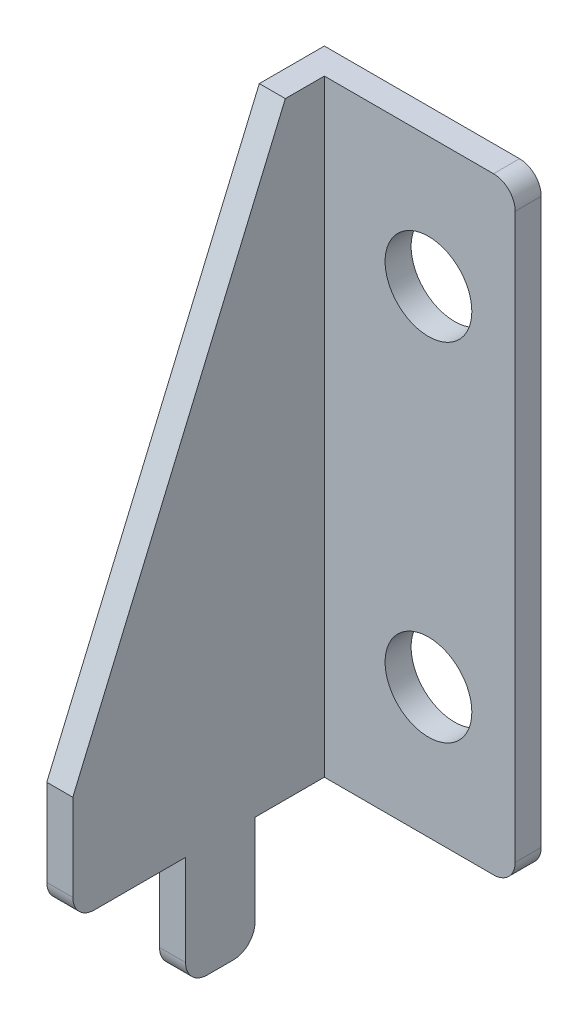
ISO-10303-21;
HEADER;
FILE_DESCRIPTION(('STEP AP214'),'2;1');
FILE_NAME('part.step','',(''),(''),'','','');
FILE_SCHEMA(('AUTOMOTIVE_DESIGN { 1 0 10303 214 1 1 1 1 }'));
ENDSEC;
DATA;
#1=APPLICATION_CONTEXT('core data for automotive mechanical design processes');
#2=APPLICATION_PROTOCOL_DEFINITION('international standard','automotive_design',2000,#1);
#3=PRODUCT_CONTEXT('',#1,'mechanical');
#4=PRODUCT('Part','Part','',(#3));
#5=PRODUCT_RELATED_PRODUCT_CATEGORY('part','',(#4));
#6=PRODUCT_DEFINITION_FORMATION('','',#4);
#7=PRODUCT_DEFINITION_CONTEXT('part definition',#1,'design');
#8=PRODUCT_DEFINITION('design','',#6,#7);
#9=PRODUCT_DEFINITION_SHAPE('','',#8);
#10=(LENGTH_UNIT() NAMED_UNIT(*) SI_UNIT(.MILLI.,.METRE.));
#11=(NAMED_UNIT(*) PLANE_ANGLE_UNIT() SI_UNIT($,.RADIAN.));
#12=(NAMED_UNIT(*) SI_UNIT($,.STERADIAN.) SOLID_ANGLE_UNIT());
#13=UNCERTAINTY_MEASURE_WITH_UNIT(LENGTH_MEASURE(1.E-05),#10,'distance_accuracy_value','');
#14=(GEOMETRIC_REPRESENTATION_CONTEXT(3) GLOBAL_UNCERTAINTY_ASSIGNED_CONTEXT((#13)) GLOBAL_UNIT_ASSIGNED_CONTEXT((#10,
#11,#12)) REPRESENTATION_CONTEXT('',''));
#15=CARTESIAN_POINT('',(0.,0.,0.));
#16=DIRECTION('',(0.,0.,1.));
#17=DIRECTION('',(1.,0.,0.));
#18=AXIS2_PLACEMENT_3D('',#15,#16,#17);
#19=CARTESIAN_POINT('',(6.2,13.5,0.6426522117404));
#20=DIRECTION('',(0.,0.,-1.));
#21=DIRECTION('',(-1.,0.,0.));
#22=AXIS2_PLACEMENT_3D('',#19,#20,#21);
#23=CYLINDRICAL_SURFACE('',#22,0.5);
#24=CARTESIAN_POINT('',(6.2,13.5,0.6));
#25=DIRECTION('',(0.,0.,-1.));
#26=DIRECTION('',(-1.,0.,0.));
#27=AXIS2_PLACEMENT_3D('',#24,#25,#26);
#28=CIRCLE('',#27,0.5);
#29=CARTESIAN_POINT('',(6.7,13.5,0.6));
#30=VERTEX_POINT('',#29);
#31=CARTESIAN_POINT('',(6.2,14.,0.6));
#32=VERTEX_POINT('',#31);
#33=EDGE_CURVE('E20',#30,#32,#28,.F.);
#34=ORIENTED_EDGE('',*,*,#33,.F.);
#35=DIRECTION('',(0.,0.,-1.));
#36=VECTOR('',#35,1.);
#37=CARTESIAN_POINT('',(6.7,13.5,0.));
#38=LINE('',#37,#36);
#39=CARTESIAN_POINT('',(6.7,13.5,0.));
#40=VERTEX_POINT('',#39);
#41=EDGE_CURVE('E104',#40,#30,#38,.F.);
#42=ORIENTED_EDGE('',*,*,#41,.F.);
#43=CARTESIAN_POINT('',(6.2,13.5,0.));
#44=DIRECTION('',(0.,0.,-1.));
#45=DIRECTION('',(-1.,0.,0.));
#46=AXIS2_PLACEMENT_3D('',#43,#44,#45);
#47=CIRCLE('',#46,0.5);
#48=CARTESIAN_POINT('',(6.2,14.,0.));
#49=VERTEX_POINT('',#48);
#50=EDGE_CURVE('E114',#40,#49,#47,.F.);
#51=ORIENTED_EDGE('',*,*,#50,.T.);
#52=DIRECTION('',(0.,0.,1.));
#53=VECTOR('',#52,1.);
#54=CARTESIAN_POINT('',(6.2,14.,0.));
#55=LINE('',#54,#53);
#56=EDGE_CURVE('E109',#32,#49,#55,.F.);
#57=ORIENTED_EDGE('',*,*,#56,.F.);
#58=EDGE_LOOP('',(#34,#42,#51,#57));
#59=FACE_BOUND('',#58,.T.);
#60=ADVANCED_FACE('F17',(#59),#23,.T.);
#61=CARTESIAN_POINT('',(6.7,14.,0.));
#62=DIRECTION('',(0.,1.,0.));
#63=DIRECTION('',(0.,0.,1.));
#64=AXIS2_PLACEMENT_3D('',#61,#62,#63);
#65=PLANE('',#64);
#66=DIRECTION('',(1.,0.,0.));
#67=VECTOR('',#66,1.);
#68=CARTESIAN_POINT('',(0.,14.,0.6));
#69=LINE('',#68,#67);
#70=CARTESIAN_POINT('',(2.3,14.,0.6));
#71=VERTEX_POINT('',#70);
#72=EDGE_CURVE('E122',#32,#71,#69,.F.);
#73=ORIENTED_EDGE('',*,*,#72,.F.);
#74=ORIENTED_EDGE('',*,*,#56,.T.);
#75=DIRECTION('',(1.,0.,0.));
#76=VECTOR('',#75,1.);
#77=CARTESIAN_POINT('',(0.,14.,0.));
#78=LINE('',#77,#76);
#79=CARTESIAN_POINT('',(1.7,14.,0.));
#80=VERTEX_POINT('',#79);
#81=EDGE_CURVE('E198',#49,#80,#78,.F.);
#82=ORIENTED_EDGE('',*,*,#81,.T.);
#83=DIRECTION('',(0.,0.,1.));
#84=VECTOR('',#83,1.);
#85=CARTESIAN_POINT('',(1.7,14.,0.));
#86=LINE('',#85,#84);
#87=CARTESIAN_POINT('',(1.7,14.,1.5));
#88=VERTEX_POINT('',#87);
#89=EDGE_CURVE('E118',#80,#88,#86,.T.);
#90=ORIENTED_EDGE('',*,*,#89,.T.);
#91=DIRECTION('',(1.,0.,0.));
#92=VECTOR('',#91,1.);
#93=CARTESIAN_POINT('',(1.7,14.,1.5));
#94=LINE('',#93,#92);
#95=CARTESIAN_POINT('',(2.3,14.,1.5));
#96=VERTEX_POINT('',#95);
#97=EDGE_CURVE('E156',#96,#88,#94,.F.);
#98=ORIENTED_EDGE('',*,*,#97,.F.);
#99=DIRECTION('',(0.,0.,-1.));
#100=VECTOR('',#99,1.);
#101=CARTESIAN_POINT('',(2.3,14.,0.));
#102=LINE('',#101,#100);
#103=EDGE_CURVE('E126',#71,#96,#102,.F.);
#104=ORIENTED_EDGE('',*,*,#103,.F.);
#105=EDGE_LOOP('',(#73,#74,#82,#90,#98,#104));
#106=FACE_BOUND('',#105,.T.);
#107=ADVANCED_FACE('F123',(#106),#65,.T.);
#108=CARTESIAN_POINT('',(6.7,0.,0.));
#109=DIRECTION('',(1.,0.,0.));
#110=DIRECTION('',(0.,0.,-1.));
#111=AXIS2_PLACEMENT_3D('',#108,#109,#110);
#112=PLANE('',#111);
#113=DIRECTION('',(0.,1.,0.));
#114=VECTOR('',#113,1.);
#115=CARTESIAN_POINT('',(6.7,0.,0.));
#116=LINE('',#115,#114);
#117=CARTESIAN_POINT('',(6.7,0.5,0.));
#118=VERTEX_POINT('',#117);
#119=EDGE_CURVE('E194',#118,#40,#116,.T.);
#120=ORIENTED_EDGE('',*,*,#119,.T.);
#121=ORIENTED_EDGE('',*,*,#41,.T.);
#122=DIRECTION('',(0.,1.,0.));
#123=VECTOR('',#122,1.);
#124=CARTESIAN_POINT('',(6.7,0.,0.6));
#125=LINE('',#124,#123);
#126=CARTESIAN_POINT('',(6.7,0.5,0.6));
#127=VERTEX_POINT('',#126);
#128=EDGE_CURVE('E130',#127,#30,#125,.T.);
#129=ORIENTED_EDGE('',*,*,#128,.F.);
#130=DIRECTION('',(0.,0.,-1.));
#131=VECTOR('',#130,1.);
#132=CARTESIAN_POINT('',(6.7,0.5,0.6289167537223));
#133=LINE('',#132,#131);
#134=EDGE_CURVE('E145',#118,#127,#133,.F.);
#135=ORIENTED_EDGE('',*,*,#134,.F.);
#136=EDGE_LOOP('',(#120,#121,#129,#135));
#137=FACE_BOUND('',#136,.T.);
#138=ADVANCED_FACE('F397',(#137),#112,.T.);
#139=CARTESIAN_POINT('',(4.7,3.,0.6));
#140=DIRECTION('',(0.,0.,1.));
#141=DIRECTION('',(1.,0.,0.));
#142=AXIS2_PLACEMENT_3D('',#139,#140,#141);
#143=CYLINDRICAL_SURFACE('',#142,1.);
#144=CARTESIAN_POINT('',(4.7,3.,0.6));
#145=DIRECTION('',(0.,0.,1.));
#146=DIRECTION('',(1.,0.,0.));
#147=AXIS2_PLACEMENT_3D('',#144,#145,#146);
#148=CIRCLE('',#147,1.);
#149=CARTESIAN_POINT('',(5.7,3.,0.6));
#150=VERTEX_POINT('',#149);
#151=EDGE_CURVE('E134',#150,#150,#148,.F.);
#152=ORIENTED_EDGE('',*,*,#151,.F.);
#153=EDGE_LOOP('',(#152));
#154=FACE_BOUND('',#153,.T.);
#155=CARTESIAN_POINT('',(4.7,3.,0.));
#156=DIRECTION('',(0.,0.,1.));
#157=DIRECTION('',(1.,0.,0.));
#158=AXIS2_PLACEMENT_3D('',#155,#156,#157);
#159=CIRCLE('',#158,1.);
#160=CARTESIAN_POINT('',(5.7,3.,0.));
#161=VERTEX_POINT('',#160);
#162=EDGE_CURVE('E191',#161,#161,#159,.F.);
#163=ORIENTED_EDGE('',*,*,#162,.T.);
#164=EDGE_LOOP('',(#163));
#165=FACE_BOUND('',#164,.T.);
#166=ADVANCED_FACE('F212',(#154,#165),#143,.F.);
#167=CARTESIAN_POINT('',(4.7,11.,0.6));
#168=DIRECTION('',(0.,0.,1.));
#169=DIRECTION('',(1.,0.,0.));
#170=AXIS2_PLACEMENT_3D('',#167,#168,#169);
#171=CYLINDRICAL_SURFACE('',#170,1.);
#172=CARTESIAN_POINT('',(4.7,11.,0.6));
#173=DIRECTION('',(0.,0.,1.));
#174=DIRECTION('',(1.,0.,0.));
#175=AXIS2_PLACEMENT_3D('',#172,#173,#174);
#176=CIRCLE('',#175,1.);
#177=CARTESIAN_POINT('',(5.7,11.,0.6));
#178=VERTEX_POINT('',#177);
#179=EDGE_CURVE('E136',#178,#178,#176,.F.);
#180=ORIENTED_EDGE('',*,*,#179,.F.);
#181=EDGE_LOOP('',(#180));
#182=FACE_BOUND('',#181,.T.);
#183=CARTESIAN_POINT('',(4.7,11.,0.));
#184=DIRECTION('',(0.,0.,1.));
#185=DIRECTION('',(1.,0.,0.));
#186=AXIS2_PLACEMENT_3D('',#183,#184,#185);
#187=CIRCLE('',#186,1.);
#188=CARTESIAN_POINT('',(5.7,11.,0.));
#189=VERTEX_POINT('',#188);
#190=EDGE_CURVE('E187',#189,#189,#187,.F.);
#191=ORIENTED_EDGE('',*,*,#190,.T.);
#192=EDGE_LOOP('',(#191));
#193=FACE_BOUND('',#192,.T.);
#194=ADVANCED_FACE('F209',(#182,#193),#171,.F.);
#195=CARTESIAN_POINT('',(0.,0.,0.6));
#196=DIRECTION('',(0.,0.,1.));
#197=DIRECTION('',(1.,0.,0.));
#198=AXIS2_PLACEMENT_3D('',#195,#196,#197);
#199=PLANE('',#198);
#200=ORIENTED_EDGE('',*,*,#179,.T.);
#201=EDGE_LOOP('',(#200));
#202=FACE_BOUND('',#201,.T.);
#203=ORIENTED_EDGE('',*,*,#151,.T.);
#204=EDGE_LOOP('',(#203));
#205=FACE_BOUND('',#204,.T.);
#206=ORIENTED_EDGE('',*,*,#128,.T.);
#207=ORIENTED_EDGE('',*,*,#33,.T.);
#208=ORIENTED_EDGE('',*,*,#72,.T.);
#209=DIRECTION('',(0.,1.,0.));
#210=VECTOR('',#209,1.);
#211=CARTESIAN_POINT('',(2.3,14.,0.6));
#212=LINE('',#211,#210);
#213=CARTESIAN_POINT('',(2.3,0.,0.6));
#214=VERTEX_POINT('',#213);
#215=EDGE_CURVE('E162',#214,#71,#212,.T.);
#216=ORIENTED_EDGE('',*,*,#215,.F.);
#217=DIRECTION('',(1.,0.,0.));
#218=VECTOR('',#217,1.);
#219=CARTESIAN_POINT('',(1.7,0.,0.6));
#220=LINE('',#219,#218);
#221=CARTESIAN_POINT('',(6.2,0.,0.6));
#222=VERTEX_POINT('',#221);
#223=EDGE_CURVE('E190',#222,#214,#220,.F.);
#224=ORIENTED_EDGE('',*,*,#223,.F.);
#225=CARTESIAN_POINT('',(6.2,0.5,0.6));
#226=DIRECTION('',(0.,0.,-1.));
#227=DIRECTION('',(-1.,0.,0.));
#228=AXIS2_PLACEMENT_3D('',#225,#226,#227);
#229=CIRCLE('',#228,0.5);
#230=EDGE_CURVE('E147',#127,#222,#229,.T.);
#231=ORIENTED_EDGE('',*,*,#230,.F.);
#232=EDGE_LOOP('',(#206,#207,#208,#216,#224,#231));
#233=FACE_BOUND('',#232,.T.);
#234=ADVANCED_FACE('F132',(#202,#205,#233),#199,.T.);
#235=CARTESIAN_POINT('',(6.2,0.5,0.6289167537223));
#236=DIRECTION('',(0.,0.,-1.));
#237=DIRECTION('',(-1.,0.,0.));
#238=AXIS2_PLACEMENT_3D('',#235,#236,#237);
#239=CYLINDRICAL_SURFACE('',#238,0.5);
#240=ORIENTED_EDGE('',*,*,#230,.T.);
#241=DIRECTION('',(0.,0.,-1.));
#242=VECTOR('',#241,1.);
#243=CARTESIAN_POINT('',(6.2,0.,0.));
#244=LINE('',#243,#242);
#245=CARTESIAN_POINT('',(6.2,0.,0.));
#246=VERTEX_POINT('',#245);
#247=EDGE_CURVE('E234',#246,#222,#244,.F.);
#248=ORIENTED_EDGE('',*,*,#247,.F.);
#249=CARTESIAN_POINT('',(6.2,0.5,0.));
#250=DIRECTION('',(0.,0.,-1.));
#251=DIRECTION('',(-1.,0.,0.));
#252=AXIS2_PLACEMENT_3D('',#249,#250,#251);
#253=CIRCLE('',#252,0.5);
#254=EDGE_CURVE('E195',#246,#118,#253,.F.);
#255=ORIENTED_EDGE('',*,*,#254,.T.);
#256=ORIENTED_EDGE('',*,*,#134,.T.);
#257=EDGE_LOOP('',(#240,#248,#255,#256));
#258=FACE_BOUND('',#257,.T.);
#259=ADVANCED_FACE('F235',(#258),#239,.T.);
#260=CARTESIAN_POINT('',(2.3,14.,0.));
#261=DIRECTION('',(1.,0.,0.));
#262=DIRECTION('',(0.,0.,-1.));
#263=AXIS2_PLACEMENT_3D('',#260,#261,#262);
#264=PLANE('',#263);
#265=DIRECTION('',(0.,1.,0.));
#266=VECTOR('',#265,1.);
#267=CARTESIAN_POINT('',(2.3,2.5,6.4));
#268=LINE('',#267,#266);
#269=CARTESIAN_POINT('',(2.3,0.5,6.4));
#270=VERTEX_POINT('',#269);
#271=CARTESIAN_POINT('',(2.3,2.50000000000012,6.40000000000028));
#272=VERTEX_POINT('',#271);
#273=EDGE_CURVE('E201',#270,#272,#268,.T.);
#274=ORIENTED_EDGE('',*,*,#273,.F.);
#275=CARTESIAN_POINT('',(2.3,0.5,5.9));
#276=DIRECTION('',(-1.,0.,0.));
#277=DIRECTION('',(0.,0.,1.));
#278=AXIS2_PLACEMENT_3D('',#275,#276,#277);
#279=CIRCLE('',#278,0.5);
#280=CARTESIAN_POINT('',(2.3,0.,5.9));
#281=VERTEX_POINT('',#280);
#282=EDGE_CURVE('E161',#270,#281,#279,.F.);
#283=ORIENTED_EDGE('',*,*,#282,.T.);
#284=DIRECTION('',(0.,0.,-1.));
#285=VECTOR('',#284,1.);
#286=CARTESIAN_POINT('',(2.3,0.,6.4));
#287=LINE('',#286,#285);
#288=CARTESIAN_POINT('',(2.3,0.,3.8));
#289=VERTEX_POINT('',#288);
#290=EDGE_CURVE('E276',#289,#281,#287,.F.);
#291=ORIENTED_EDGE('',*,*,#290,.F.);
#292=DIRECTION('',(0.,1.,0.));
#293=VECTOR('',#292,1.);
#294=CARTESIAN_POINT('',(2.3,0.,3.8));
#295=LINE('',#294,#293);
#296=CARTESIAN_POINT('',(2.3,-2.1,3.8));
#297=VERTEX_POINT('',#296);
#298=EDGE_CURVE('E181',#297,#289,#295,.T.);
#299=ORIENTED_EDGE('',*,*,#298,.F.);
#300=CARTESIAN_POINT('',(2.3,-2.1,3.3));
#301=DIRECTION('',(-1.,0.,0.));
#302=DIRECTION('',(0.,0.,1.));
#303=AXIS2_PLACEMENT_3D('',#300,#301,#302);
#304=CIRCLE('',#303,0.5);
#305=CARTESIAN_POINT('',(2.3,-2.6,3.3));
#306=VERTEX_POINT('',#305);
#307=EDGE_CURVE('E178',#306,#297,#304,.T.);
#308=ORIENTED_EDGE('',*,*,#307,.F.);
#309=DIRECTION('',(0.,0.,-1.));
#310=VECTOR('',#309,1.);
#311=CARTESIAN_POINT('',(2.3,-2.6,3.8));
#312=LINE('',#311,#310);
#313=CARTESIAN_POINT('',(2.3,-2.6,2.7));
#314=VERTEX_POINT('',#313);
#315=EDGE_CURVE('E286',#314,#306,#312,.F.);
#316=ORIENTED_EDGE('',*,*,#315,.F.);
#317=CARTESIAN_POINT('',(2.3,-2.1,2.7));
#318=DIRECTION('',(-1.,0.,0.));
#319=DIRECTION('',(0.,0.,1.));
#320=AXIS2_PLACEMENT_3D('',#317,#318,#319);
#321=CIRCLE('',#320,0.5);
#322=CARTESIAN_POINT('',(2.3,-2.1,2.2));
#323=VERTEX_POINT('',#322);
#324=EDGE_CURVE('E183',#323,#314,#321,.T.);
#325=ORIENTED_EDGE('',*,*,#324,.F.);
#326=DIRECTION('',(0.,1.,0.));
#327=VECTOR('',#326,1.);
#328=CARTESIAN_POINT('',(2.3,-2.6,2.2));
#329=LINE('',#328,#327);
#330=CARTESIAN_POINT('',(2.3,0.,2.2));
#331=VERTEX_POINT('',#330);
#332=EDGE_CURVE('E288',#331,#323,#329,.F.);
#333=ORIENTED_EDGE('',*,*,#332,.F.);
#334=DIRECTION('',(0.,0.,-1.));
#335=VECTOR('',#334,1.);
#336=CARTESIAN_POINT('',(2.3,0.,0.));
#337=LINE('',#336,#335);
#338=EDGE_CURVE('E244',#214,#331,#337,.F.);
#339=ORIENTED_EDGE('',*,*,#338,.F.);
#340=ORIENTED_EDGE('',*,*,#215,.T.);
#341=ORIENTED_EDGE('',*,*,#103,.T.);
#342=DIRECTION('',(0.,-0.919970561413031,0.391987456602113));
#343=VECTOR('',#342,1.);
#344=CARTESIAN_POINT('',(2.3,14.,1.5));
#345=LINE('',#344,#343);
#346=EDGE_CURVE('E153',#272,#96,#345,.F.);
#347=ORIENTED_EDGE('',*,*,#346,.F.);
#348=EDGE_LOOP('',(#274,#283,#291,#299,#308,#316,#325,#333,#339,#340,#341,#347));
#349=FACE_BOUND('',#348,.T.);
#350=ADVANCED_FACE('F301',(#349),#264,.T.);
#351=CARTESIAN_POINT('',(1.7,2.5,6.4));
#352=DIRECTION('',(0.,0.,1.));
#353=DIRECTION('',(1.,0.,0.));
#354=AXIS2_PLACEMENT_3D('',#351,#352,#353);
#355=PLANE('',#354);
#356=DIRECTION('',(0.,1.,0.));
#357=VECTOR('',#356,1.);
#358=CARTESIAN_POINT('',(1.7,14.,6.4));
#359=LINE('',#358,#357);
#360=CARTESIAN_POINT('',(1.7,0.5,6.4));
#361=VERTEX_POINT('',#360);
#362=CARTESIAN_POINT('',(1.7,2.50000000000005,6.40000000000014));
#363=VERTEX_POINT('',#362);
#364=EDGE_CURVE('E265',#361,#363,#359,.T.);
#365=ORIENTED_EDGE('',*,*,#364,.F.);
#366=DIRECTION('',(-1.,0.,0.));
#367=VECTOR('',#366,1.);
#368=CARTESIAN_POINT('',(2.328916753722,0.5,6.4));
#369=LINE('',#368,#367);
#370=EDGE_CURVE('E325',#270,#361,#369,.T.);
#371=ORIENTED_EDGE('',*,*,#370,.F.);
#372=ORIENTED_EDGE('',*,*,#273,.T.);
#373=DIRECTION('',(1.,0.,0.));
#374=VECTOR('',#373,1.);
#375=CARTESIAN_POINT('',(1.7,2.50000000000018,6.40000000000041));
#376=LINE('',#375,#374);
#377=EDGE_CURVE('E157',#363,#272,#376,.T.);
#378=ORIENTED_EDGE('',*,*,#377,.F.);
#379=EDGE_LOOP('',(#365,#371,#372,#378));
#380=FACE_BOUND('',#379,.T.);
#381=ADVANCED_FACE('F384',(#380),#355,.T.);
#382=CARTESIAN_POINT('',(1.7,14.,1.5));
#383=DIRECTION('',(0.,0.391987456602113,0.919970561413031));
#384=DIRECTION('',(0.,-0.919970561413031,0.391987456602113));
#385=AXIS2_PLACEMENT_3D('',#382,#383,#384);
#386=PLANE('',#385);
#387=ORIENTED_EDGE('',*,*,#97,.T.);
#388=DIRECTION('',(0.,0.919970561413045,-0.39198745660208));
#389=VECTOR('',#388,1.);
#390=CARTESIAN_POINT('',(1.7,2.5,6.4));
#391=LINE('',#390,#389);
#392=EDGE_CURVE('E256',#363,#88,#391,.T.);
#393=ORIENTED_EDGE('',*,*,#392,.F.);
#394=ORIENTED_EDGE('',*,*,#377,.T.);
#395=ORIENTED_EDGE('',*,*,#346,.T.);
#396=EDGE_LOOP('',(#387,#393,#394,#395));
#397=FACE_BOUND('',#396,.T.);
#398=ADVANCED_FACE('F220',(#397),#386,.T.);
#399=CARTESIAN_POINT('',(0.,0.,0.));
#400=DIRECTION('',(0.,0.,1.));
#401=DIRECTION('',(1.,0.,0.));
#402=AXIS2_PLACEMENT_3D('',#399,#400,#401);
#403=PLANE('',#402);
#404=ORIENTED_EDGE('',*,*,#190,.F.);
#405=EDGE_LOOP('',(#404));
#406=FACE_BOUND('',#405,.T.);
#407=ORIENTED_EDGE('',*,*,#162,.F.);
#408=EDGE_LOOP('',(#407));
#409=FACE_BOUND('',#408,.T.);
#410=ORIENTED_EDGE('',*,*,#254,.F.);
#411=DIRECTION('',(1.,0.,0.));
#412=VECTOR('',#411,1.);
#413=CARTESIAN_POINT('',(1.7,0.,0.));
#414=LINE('',#413,#412);
#415=CARTESIAN_POINT('',(1.7,0.,0.));
#416=VERTEX_POINT('',#415);
#417=EDGE_CURVE('E230',#416,#246,#414,.T.);
#418=ORIENTED_EDGE('',*,*,#417,.F.);
#419=DIRECTION('',(0.,1.,0.));
#420=VECTOR('',#419,1.);
#421=CARTESIAN_POINT('',(1.7,14.,0.));
#422=LINE('',#421,#420);
#423=EDGE_CURVE('E254',#80,#416,#422,.F.);
#424=ORIENTED_EDGE('',*,*,#423,.F.);
#425=ORIENTED_EDGE('',*,*,#81,.F.);
#426=ORIENTED_EDGE('',*,*,#50,.F.);
#427=ORIENTED_EDGE('',*,*,#119,.F.);
#428=EDGE_LOOP('',(#410,#418,#424,#425,#426,#427));
#429=FACE_BOUND('',#428,.T.);
#430=ADVANCED_FACE('F216',(#406,#409,#429),#403,.F.);
#431=CARTESIAN_POINT('',(1.7,0.,0.));
#432=DIRECTION('',(0.,-1.,0.));
#433=DIRECTION('',(0.,0.,-1.));
#434=AXIS2_PLACEMENT_3D('',#431,#432,#433);
#435=PLANE('',#434);
#436=ORIENTED_EDGE('',*,*,#417,.T.);
#437=ORIENTED_EDGE('',*,*,#247,.T.);
#438=ORIENTED_EDGE('',*,*,#223,.T.);
#439=ORIENTED_EDGE('',*,*,#338,.T.);
#440=DIRECTION('',(-1.,0.,0.));
#441=VECTOR('',#440,1.);
#442=CARTESIAN_POINT('',(1.7,0.,2.2));
#443=LINE('',#442,#441);
#444=CARTESIAN_POINT('',(1.7,0.,2.2));
#445=VERTEX_POINT('',#444);
#446=EDGE_CURVE('E238',#445,#331,#443,.F.);
#447=ORIENTED_EDGE('',*,*,#446,.F.);
#448=DIRECTION('',(0.,0.,1.));
#449=VECTOR('',#448,1.);
#450=CARTESIAN_POINT('',(1.7,0.,0.));
#451=LINE('',#450,#449);
#452=EDGE_CURVE('E242',#416,#445,#451,.T.);
#453=ORIENTED_EDGE('',*,*,#452,.F.);
#454=EDGE_LOOP('',(#436,#437,#438,#439,#447,#453));
#455=FACE_BOUND('',#454,.T.);
#456=ADVANCED_FACE('F219',(#455),#435,.T.);
#457=CARTESIAN_POINT('',(1.7,-2.6,2.2));
#458=DIRECTION('',(0.,0.,-1.));
#459=DIRECTION('',(-1.,0.,0.));
#460=AXIS2_PLACEMENT_3D('',#457,#458,#459);
#461=PLANE('',#460);
#462=ORIENTED_EDGE('',*,*,#332,.T.);
#463=DIRECTION('',(-1.,0.,0.));
#464=VECTOR('',#463,1.);
#465=CARTESIAN_POINT('',(2.328916753722,-2.1,2.2));
#466=LINE('',#465,#464);
#467=CARTESIAN_POINT('',(1.7,-2.1,2.2));
#468=VERTEX_POINT('',#467);
#469=EDGE_CURVE('E186',#468,#323,#466,.F.);
#470=ORIENTED_EDGE('',*,*,#469,.F.);
#471=DIRECTION('',(0.,1.,0.));
#472=VECTOR('',#471,1.);
#473=CARTESIAN_POINT('',(1.7,14.,2.2));
#474=LINE('',#473,#472);
#475=EDGE_CURVE('E177',#445,#468,#474,.F.);
#476=ORIENTED_EDGE('',*,*,#475,.F.);
#477=ORIENTED_EDGE('',*,*,#446,.T.);
#478=EDGE_LOOP('',(#462,#470,#476,#477));
#479=FACE_BOUND('',#478,.T.);
#480=ADVANCED_FACE('F309',(#479),#461,.T.);
#481=CARTESIAN_POINT('',(2.328916753722,-2.1,2.7));
#482=DIRECTION('',(-1.,0.,0.));
#483=DIRECTION('',(0.,0.,1.));
#484=AXIS2_PLACEMENT_3D('',#481,#482,#483);
#485=CYLINDRICAL_SURFACE('',#484,0.5);
#486=ORIENTED_EDGE('',*,*,#324,.T.);
#487=DIRECTION('',(1.,0.,0.));
#488=VECTOR('',#487,1.);
#489=CARTESIAN_POINT('',(1.7,-2.6,2.7));
#490=LINE('',#489,#488);
#491=CARTESIAN_POINT('',(1.7,-2.6,2.7));
#492=VERTEX_POINT('',#491);
#493=EDGE_CURVE('E185',#492,#314,#490,.T.);
#494=ORIENTED_EDGE('',*,*,#493,.F.);
#495=CARTESIAN_POINT('',(1.7,-2.1,2.7));
#496=DIRECTION('',(-1.,0.,0.));
#497=DIRECTION('',(0.,0.,1.));
#498=AXIS2_PLACEMENT_3D('',#495,#496,#497);
#499=CIRCLE('',#498,0.5);
#500=EDGE_CURVE('E174',#468,#492,#499,.T.);
#501=ORIENTED_EDGE('',*,*,#500,.F.);
#502=ORIENTED_EDGE('',*,*,#469,.T.);
#503=EDGE_LOOP('',(#486,#494,#501,#502));
#504=FACE_BOUND('',#503,.T.);
#505=ADVANCED_FACE('F346',(#504),#485,.T.);
#506=CARTESIAN_POINT('',(1.7,-2.6,3.8));
#507=DIRECTION('',(0.,-1.,0.));
#508=DIRECTION('',(0.,0.,-1.));
#509=AXIS2_PLACEMENT_3D('',#506,#507,#508);
#510=PLANE('',#509);
#511=ORIENTED_EDGE('',*,*,#315,.T.);
#512=DIRECTION('',(-1.,0.,0.));
#513=VECTOR('',#512,1.);
#514=CARTESIAN_POINT('',(2.328916753722,-2.6,3.3));
#515=LINE('',#514,#513);
#516=CARTESIAN_POINT('',(1.7,-2.6,3.3));
#517=VERTEX_POINT('',#516);
#518=EDGE_CURVE('E182',#517,#306,#515,.F.);
#519=ORIENTED_EDGE('',*,*,#518,.F.);
#520=DIRECTION('',(0.,0.,1.));
#521=VECTOR('',#520,1.);
#522=CARTESIAN_POINT('',(1.7,-2.6,0.));
#523=LINE('',#522,#521);
#524=EDGE_CURVE('E173',#492,#517,#523,.T.);
#525=ORIENTED_EDGE('',*,*,#524,.F.);
#526=ORIENTED_EDGE('',*,*,#493,.T.);
#527=EDGE_LOOP('',(#511,#519,#525,#526));
#528=FACE_BOUND('',#527,.T.);
#529=ADVANCED_FACE('F341',(#528),#510,.T.);
#530=CARTESIAN_POINT('',(2.328916753722,-2.1,3.3));
#531=DIRECTION('',(-1.,0.,0.));
#532=DIRECTION('',(0.,0.,1.));
#533=AXIS2_PLACEMENT_3D('',#530,#531,#532);
#534=CYLINDRICAL_SURFACE('',#533,0.5);
#535=ORIENTED_EDGE('',*,*,#307,.T.);
#536=DIRECTION('',(1.,0.,0.));
#537=VECTOR('',#536,1.);
#538=CARTESIAN_POINT('',(1.7,-2.1,3.8));
#539=LINE('',#538,#537);
#540=CARTESIAN_POINT('',(1.7,-2.1,3.8));
#541=VERTEX_POINT('',#540);
#542=EDGE_CURVE('E283',#541,#297,#539,.T.);
#543=ORIENTED_EDGE('',*,*,#542,.F.);
#544=CARTESIAN_POINT('',(1.7,-2.1,3.3));
#545=DIRECTION('',(-1.,0.,0.));
#546=DIRECTION('',(0.,0.,1.));
#547=AXIS2_PLACEMENT_3D('',#544,#545,#546);
#548=CIRCLE('',#547,0.5);
#549=EDGE_CURVE('E169',#517,#541,#548,.T.);
#550=ORIENTED_EDGE('',*,*,#549,.F.);
#551=ORIENTED_EDGE('',*,*,#518,.T.);
#552=EDGE_LOOP('',(#535,#543,#550,#551));
#553=FACE_BOUND('',#552,.T.);
#554=ADVANCED_FACE('F350',(#553),#534,.T.);
#555=CARTESIAN_POINT('',(1.7,0.,3.8));
#556=DIRECTION('',(0.,0.,1.));
#557=DIRECTION('',(1.,0.,0.));
#558=AXIS2_PLACEMENT_3D('',#555,#556,#557);
#559=PLANE('',#558);
#560=DIRECTION('',(0.,1.,0.));
#561=VECTOR('',#560,1.);
#562=CARTESIAN_POINT('',(1.7,14.,3.8));
#563=LINE('',#562,#561);
#564=CARTESIAN_POINT('',(1.7,0.,3.8));
#565=VERTEX_POINT('',#564);
#566=EDGE_CURVE('E172',#541,#565,#563,.T.);
#567=ORIENTED_EDGE('',*,*,#566,.F.);
#568=ORIENTED_EDGE('',*,*,#542,.T.);
#569=ORIENTED_EDGE('',*,*,#298,.T.);
#570=DIRECTION('',(1.,0.,0.));
#571=VECTOR('',#570,1.);
#572=CARTESIAN_POINT('',(1.7,0.,3.8));
#573=LINE('',#572,#571);
#574=EDGE_CURVE('E278',#565,#289,#573,.T.);
#575=ORIENTED_EDGE('',*,*,#574,.F.);
#576=EDGE_LOOP('',(#567,#568,#569,#575));
#577=FACE_BOUND('',#576,.T.);
#578=ADVANCED_FACE('F368',(#577),#559,.T.);
#579=CARTESIAN_POINT('',(1.7,0.,6.4));
#580=DIRECTION('',(0.,-1.,0.));
#581=DIRECTION('',(0.,0.,-1.));
#582=AXIS2_PLACEMENT_3D('',#579,#580,#581);
#583=PLANE('',#582);
#584=ORIENTED_EDGE('',*,*,#290,.T.);
#585=DIRECTION('',(-1.,0.,0.));
#586=VECTOR('',#585,1.);
#587=CARTESIAN_POINT('',(2.328916753722,0.,5.9));
#588=LINE('',#587,#586);
#589=CARTESIAN_POINT('',(1.7,0.,5.9));
#590=VERTEX_POINT('',#589);
#591=EDGE_CURVE('E35',#590,#281,#588,.F.);
#592=ORIENTED_EDGE('',*,*,#591,.F.);
#593=DIRECTION('',(0.,0.,1.));
#594=VECTOR('',#593,1.);
#595=CARTESIAN_POINT('',(1.7,0.,0.));
#596=LINE('',#595,#594);
#597=EDGE_CURVE('E26',#565,#590,#596,.T.);
#598=ORIENTED_EDGE('',*,*,#597,.F.);
#599=ORIENTED_EDGE('',*,*,#574,.T.);
#600=EDGE_LOOP('',(#584,#592,#598,#599));
#601=FACE_BOUND('',#600,.T.);
#602=ADVANCED_FACE('F362',(#601),#583,.T.);
#603=CARTESIAN_POINT('',(2.328916753722,0.5,5.9));
#604=DIRECTION('',(-1.,0.,0.));
#605=DIRECTION('',(0.,0.,1.));
#606=AXIS2_PLACEMENT_3D('',#603,#604,#605);
#607=CYLINDRICAL_SURFACE('',#606,0.5);
#608=ORIENTED_EDGE('',*,*,#282,.F.);
#609=ORIENTED_EDGE('',*,*,#370,.T.);
#610=CARTESIAN_POINT('',(1.7,0.5,5.9));
#611=DIRECTION('',(-1.,0.,0.));
#612=DIRECTION('',(0.,0.,1.));
#613=AXIS2_PLACEMENT_3D('',#610,#611,#612);
#614=CIRCLE('',#613,0.5);
#615=EDGE_CURVE('E11',#590,#361,#614,.T.);
#616=ORIENTED_EDGE('',*,*,#615,.F.);
#617=ORIENTED_EDGE('',*,*,#591,.T.);
#618=EDGE_LOOP('',(#608,#609,#616,#617));
#619=FACE_BOUND('',#618,.T.);
#620=ADVANCED_FACE('F356',(#619),#607,.T.);
#621=CARTESIAN_POINT('',(1.7,14.,0.));
#622=DIRECTION('',(-1.,0.,0.));
#623=DIRECTION('',(0.,0.,1.));
#624=AXIS2_PLACEMENT_3D('',#621,#622,#623);
#625=PLANE('',#624);
#626=ORIENTED_EDGE('',*,*,#597,.T.);
#627=ORIENTED_EDGE('',*,*,#615,.T.);
#628=ORIENTED_EDGE('',*,*,#364,.T.);
#629=ORIENTED_EDGE('',*,*,#392,.T.);
#630=ORIENTED_EDGE('',*,*,#89,.F.);
#631=ORIENTED_EDGE('',*,*,#423,.T.);
#632=ORIENTED_EDGE('',*,*,#452,.T.);
#633=ORIENTED_EDGE('',*,*,#475,.T.);
#634=ORIENTED_EDGE('',*,*,#500,.T.);
#635=ORIENTED_EDGE('',*,*,#524,.T.);
#636=ORIENTED_EDGE('',*,*,#549,.T.);
#637=ORIENTED_EDGE('',*,*,#566,.T.);
#638=EDGE_LOOP('',(#626,#627,#628,#629,#630,#631,#632,#633,#634,#635,#636,#637));
#639=FACE_BOUND('',#638,.T.);
#640=ADVANCED_FACE('F354',(#639),#625,.T.);
#641=CLOSED_SHELL('',(#60,#107,#138,#166,#194,#234,#259,#350,#381,#398,#430,#456,#480,#505,#529,
#554,#578,#602,#620,#640));
#642=MANIFOLD_SOLID_BREP('B1',#641);
#643=ADVANCED_BREP_SHAPE_REPRESENTATION('',(#18,#642),#14);
#644=SHAPE_DEFINITION_REPRESENTATION(#9,#643);
ENDSEC;
END-ISO-10303-21;
